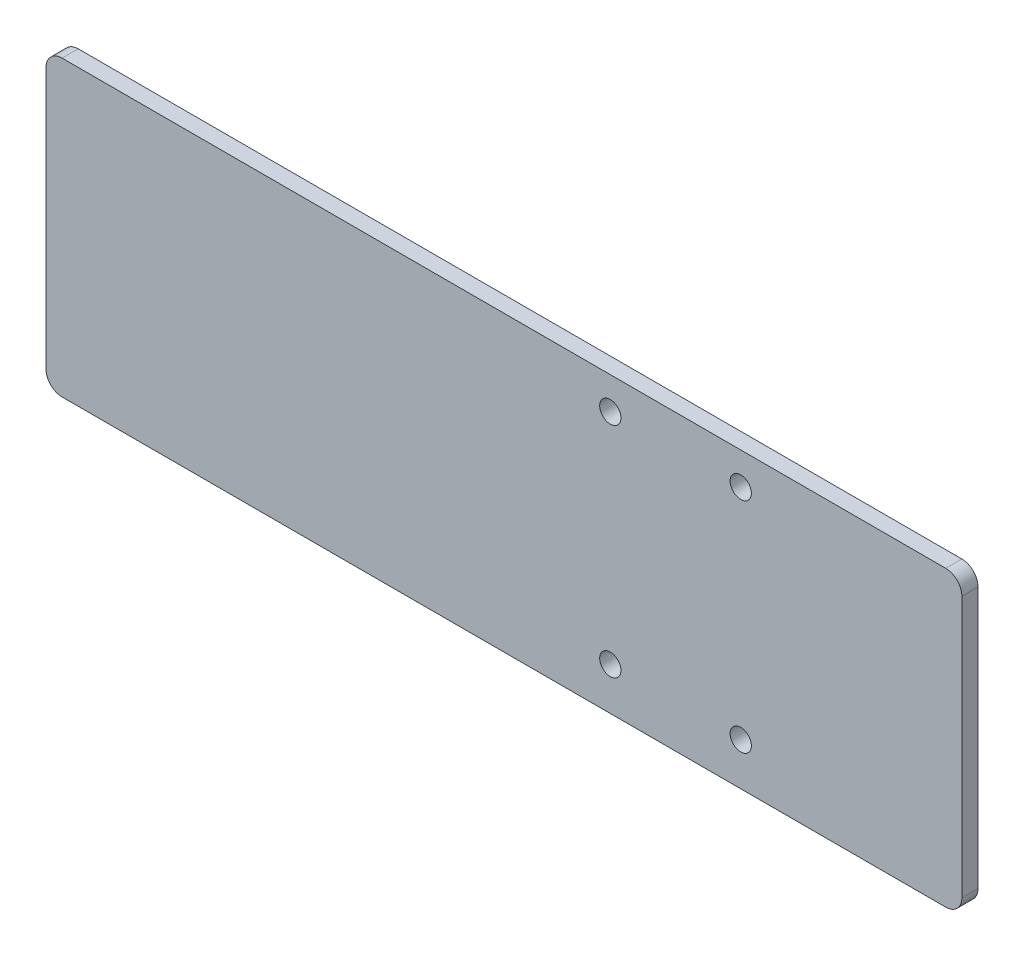
ISO-10303-21;
HEADER;
FILE_DESCRIPTION(('STEP AP214'),'2;1');
FILE_NAME('part.step','',(''),(''),'','','');
FILE_SCHEMA(('AUTOMOTIVE_DESIGN { 1 0 10303 214 1 1 1 1 }'));
ENDSEC;
DATA;
#1=APPLICATION_CONTEXT('core data for automotive mechanical design processes');
#2=APPLICATION_PROTOCOL_DEFINITION('international standard','automotive_design',2000,#1);
#3=PRODUCT_CONTEXT('',#1,'mechanical');
#4=PRODUCT('Part','Part','',(#3));
#5=PRODUCT_RELATED_PRODUCT_CATEGORY('part','',(#4));
#6=PRODUCT_DEFINITION_FORMATION('','',#4);
#7=PRODUCT_DEFINITION_CONTEXT('part definition',#1,'design');
#8=PRODUCT_DEFINITION('design','',#6,#7);
#9=PRODUCT_DEFINITION_SHAPE('','',#8);
#10=(LENGTH_UNIT() NAMED_UNIT(*) SI_UNIT(.MILLI.,.METRE.));
#11=(NAMED_UNIT(*) PLANE_ANGLE_UNIT() SI_UNIT($,.RADIAN.));
#12=(NAMED_UNIT(*) SI_UNIT($,.STERADIAN.) SOLID_ANGLE_UNIT());
#13=UNCERTAINTY_MEASURE_WITH_UNIT(LENGTH_MEASURE(1.E-05),#10,'distance_accuracy_value','');
#14=(GEOMETRIC_REPRESENTATION_CONTEXT(3) GLOBAL_UNCERTAINTY_ASSIGNED_CONTEXT((#13)) GLOBAL_UNIT_ASSIGNED_CONTEXT((#10,
#11,#12)) REPRESENTATION_CONTEXT('',''));
#15=CARTESIAN_POINT('',(0.,0.,0.));
#16=DIRECTION('',(0.,0.,1.));
#17=DIRECTION('',(1.,0.,0.));
#18=AXIS2_PLACEMENT_3D('',#15,#16,#17);
#19=CARTESIAN_POINT('',(137.,40.5,5.));
#20=DIRECTION('',(0.,0.,-1.));
#21=DIRECTION('',(-1.,0.,0.));
#22=AXIS2_PLACEMENT_3D('',#19,#20,#21);
#23=CYLINDRICAL_SURFACE('',#22,4.99999999999999);
#24=CARTESIAN_POINT('',(137.,40.5,0.));
#25=DIRECTION('',(0.,0.,1.));
#26=DIRECTION('',(1.,0.,0.));
#27=AXIS2_PLACEMENT_3D('',#24,#25,#26);
#28=CIRCLE('',#27,4.99999999999999);
#29=CARTESIAN_POINT('',(142.,40.5,0.));
#30=VERTEX_POINT('',#29);
#31=CARTESIAN_POINT('',(137.,45.5,0.));
#32=VERTEX_POINT('',#31);
#33=EDGE_CURVE('E129',#30,#32,#28,.T.);
#34=ORIENTED_EDGE('',*,*,#33,.T.);
#35=DIRECTION('',(0.,0.,-1.));
#36=VECTOR('',#35,1.);
#37=CARTESIAN_POINT('',(137.,45.5,5.));
#38=LINE('',#37,#36);
#39=CARTESIAN_POINT('',(137.,45.5,5.));
#40=VERTEX_POINT('',#39);
#41=EDGE_CURVE('E11',#40,#32,#38,.T.);
#42=ORIENTED_EDGE('',*,*,#41,.F.);
#43=CARTESIAN_POINT('',(137.,40.5,5.));
#44=DIRECTION('',(0.,0.,1.));
#45=DIRECTION('',(1.,0.,0.));
#46=AXIS2_PLACEMENT_3D('',#43,#44,#45);
#47=CIRCLE('',#46,4.99999999999999);
#48=CARTESIAN_POINT('',(142.,40.5,5.));
#49=VERTEX_POINT('',#48);
#50=EDGE_CURVE('E144',#49,#40,#47,.T.);
#51=ORIENTED_EDGE('',*,*,#50,.F.);
#52=DIRECTION('',(0.,0.,-1.));
#53=VECTOR('',#52,1.);
#54=CARTESIAN_POINT('',(142.,40.5,5.));
#55=LINE('',#54,#53);
#56=EDGE_CURVE('E125',#49,#30,#55,.T.);
#57=ORIENTED_EDGE('',*,*,#56,.T.);
#58=EDGE_LOOP('',(#34,#42,#51,#57));
#59=FACE_BOUND('',#58,.T.);
#60=ADVANCED_FACE('F33',(#59),#23,.T.);
#61=CARTESIAN_POINT('',(-137.,45.5,5.));
#62=DIRECTION('',(0.,-1.,0.));
#63=DIRECTION('',(0.,0.,-1.));
#64=AXIS2_PLACEMENT_3D('',#61,#62,#63);
#65=PLANE('',#64);
#66=DIRECTION('',(-1.,0.,0.));
#67=VECTOR('',#66,1.);
#68=CARTESIAN_POINT('',(-137.,45.5,0.));
#69=LINE('',#68,#67);
#70=CARTESIAN_POINT('',(-137.,45.5,0.));
#71=VERTEX_POINT('',#70);
#72=EDGE_CURVE('E132',#32,#71,#69,.T.);
#73=ORIENTED_EDGE('',*,*,#72,.T.);
#74=DIRECTION('',(0.,0.,-1.));
#75=VECTOR('',#74,1.);
#76=CARTESIAN_POINT('',(-137.,45.5,5.));
#77=LINE('',#76,#75);
#78=CARTESIAN_POINT('',(-137.,45.5,5.));
#79=VERTEX_POINT('',#78);
#80=EDGE_CURVE('E41',#79,#71,#77,.T.);
#81=ORIENTED_EDGE('',*,*,#80,.F.);
#82=DIRECTION('',(-1.,0.,0.));
#83=VECTOR('',#82,1.);
#84=CARTESIAN_POINT('',(-137.,45.5,5.));
#85=LINE('',#84,#83);
#86=EDGE_CURVE('E92',#40,#79,#85,.T.);
#87=ORIENTED_EDGE('',*,*,#86,.F.);
#88=ORIENTED_EDGE('',*,*,#41,.T.);
#89=EDGE_LOOP('',(#73,#81,#87,#88));
#90=FACE_BOUND('',#89,.T.);
#91=ADVANCED_FACE('F225',(#90),#65,.F.);
#92=CARTESIAN_POINT('',(-137.,40.5,5.));
#93=DIRECTION('',(0.,0.,-1.));
#94=DIRECTION('',(-1.,0.,0.));
#95=AXIS2_PLACEMENT_3D('',#92,#93,#94);
#96=CYLINDRICAL_SURFACE('',#95,5.);
#97=CARTESIAN_POINT('',(-137.,40.5,0.));
#98=DIRECTION('',(0.,0.,1.));
#99=DIRECTION('',(-1.,0.,0.));
#100=AXIS2_PLACEMENT_3D('',#97,#98,#99);
#101=CIRCLE('',#100,5.);
#102=CARTESIAN_POINT('',(-142.,40.5,0.));
#103=VERTEX_POINT('',#102);
#104=EDGE_CURVE('E135',#71,#103,#101,.T.);
#105=ORIENTED_EDGE('',*,*,#104,.T.);
#106=DIRECTION('',(0.,0.,-1.));
#107=VECTOR('',#106,1.);
#108=CARTESIAN_POINT('',(-142.,40.5,5.));
#109=LINE('',#108,#107);
#110=CARTESIAN_POINT('',(-142.,40.5,5.));
#111=VERTEX_POINT('',#110);
#112=EDGE_CURVE('E151',#111,#103,#109,.T.);
#113=ORIENTED_EDGE('',*,*,#112,.F.);
#114=CARTESIAN_POINT('',(-137.,40.5,5.));
#115=DIRECTION('',(0.,0.,1.));
#116=DIRECTION('',(-1.,0.,0.));
#117=AXIS2_PLACEMENT_3D('',#114,#115,#116);
#118=CIRCLE('',#117,5.);
#119=EDGE_CURVE('E159',#79,#111,#118,.T.);
#120=ORIENTED_EDGE('',*,*,#119,.F.);
#121=ORIENTED_EDGE('',*,*,#80,.T.);
#122=EDGE_LOOP('',(#105,#113,#120,#121));
#123=FACE_BOUND('',#122,.T.);
#124=ADVANCED_FACE('F157',(#123),#96,.T.);
#125=CARTESIAN_POINT('',(-142.,-40.5,5.));
#126=DIRECTION('',(1.,0.,0.));
#127=DIRECTION('',(0.,0.,-1.));
#128=AXIS2_PLACEMENT_3D('',#125,#126,#127);
#129=PLANE('',#128);
#130=DIRECTION('',(0.,-1.,0.));
#131=VECTOR('',#130,1.);
#132=CARTESIAN_POINT('',(-142.,-40.5,0.));
#133=LINE('',#132,#131);
#134=CARTESIAN_POINT('',(-142.,-40.5,0.));
#135=VERTEX_POINT('',#134);
#136=EDGE_CURVE('E137',#103,#135,#133,.T.);
#137=ORIENTED_EDGE('',*,*,#136,.T.);
#138=DIRECTION('',(0.,0.,-1.));
#139=VECTOR('',#138,1.);
#140=CARTESIAN_POINT('',(-142.,-40.5,5.));
#141=LINE('',#140,#139);
#142=CARTESIAN_POINT('',(-142.,-40.5,5.));
#143=VERTEX_POINT('',#142);
#144=EDGE_CURVE('E148',#143,#135,#141,.T.);
#145=ORIENTED_EDGE('',*,*,#144,.F.);
#146=DIRECTION('',(0.,-1.,0.));
#147=VECTOR('',#146,1.);
#148=CARTESIAN_POINT('',(-142.,-40.5,5.));
#149=LINE('',#148,#147);
#150=EDGE_CURVE('E171',#111,#143,#149,.T.);
#151=ORIENTED_EDGE('',*,*,#150,.F.);
#152=ORIENTED_EDGE('',*,*,#112,.T.);
#153=EDGE_LOOP('',(#137,#145,#151,#152));
#154=FACE_BOUND('',#153,.T.);
#155=ADVANCED_FACE('F167',(#154),#129,.F.);
#156=CARTESIAN_POINT('',(-137.,-40.5,5.));
#157=DIRECTION('',(0.,0.,-1.));
#158=DIRECTION('',(-1.,0.,0.));
#159=AXIS2_PLACEMENT_3D('',#156,#157,#158);
#160=CYLINDRICAL_SURFACE('',#159,5.);
#161=CARTESIAN_POINT('',(-137.,-40.5,0.));
#162=DIRECTION('',(0.,0.,1.));
#163=DIRECTION('',(-1.,0.,0.));
#164=AXIS2_PLACEMENT_3D('',#161,#162,#163);
#165=CIRCLE('',#164,5.);
#166=CARTESIAN_POINT('',(-137.,-45.5,0.));
#167=VERTEX_POINT('',#166);
#168=EDGE_CURVE('E139',#135,#167,#165,.T.);
#169=ORIENTED_EDGE('',*,*,#168,.T.);
#170=DIRECTION('',(0.,0.,-1.));
#171=VECTOR('',#170,1.);
#172=CARTESIAN_POINT('',(-137.,-45.5,5.));
#173=LINE('',#172,#171);
#174=CARTESIAN_POINT('',(-137.,-45.5,5.));
#175=VERTEX_POINT('',#174);
#176=EDGE_CURVE('E120',#175,#167,#173,.T.);
#177=ORIENTED_EDGE('',*,*,#176,.F.);
#178=CARTESIAN_POINT('',(-137.,-40.5,5.));
#179=DIRECTION('',(0.,0.,1.));
#180=DIRECTION('',(-1.,0.,0.));
#181=AXIS2_PLACEMENT_3D('',#178,#179,#180);
#182=CIRCLE('',#181,5.);
#183=EDGE_CURVE('E111',#143,#175,#182,.T.);
#184=ORIENTED_EDGE('',*,*,#183,.F.);
#185=ORIENTED_EDGE('',*,*,#144,.T.);
#186=EDGE_LOOP('',(#169,#177,#184,#185));
#187=FACE_BOUND('',#186,.T.);
#188=ADVANCED_FACE('F170',(#187),#160,.T.);
#189=CARTESIAN_POINT('',(-137.,-45.5,5.));
#190=DIRECTION('',(0.,1.,0.));
#191=DIRECTION('',(0.,0.,1.));
#192=AXIS2_PLACEMENT_3D('',#189,#190,#191);
#193=PLANE('',#192);
#194=DIRECTION('',(1.,0.,0.));
#195=VECTOR('',#194,1.);
#196=CARTESIAN_POINT('',(-137.,-45.5,0.));
#197=LINE('',#196,#195);
#198=CARTESIAN_POINT('',(137.,-45.5,0.));
#199=VERTEX_POINT('',#198);
#200=EDGE_CURVE('E119',#167,#199,#197,.T.);
#201=ORIENTED_EDGE('',*,*,#200,.T.);
#202=DIRECTION('',(0.,0.,-1.));
#203=VECTOR('',#202,1.);
#204=CARTESIAN_POINT('',(137.,-45.5,5.));
#205=LINE('',#204,#203);
#206=CARTESIAN_POINT('',(137.,-45.5,5.));
#207=VERTEX_POINT('',#206);
#208=EDGE_CURVE('E116',#207,#199,#205,.T.);
#209=ORIENTED_EDGE('',*,*,#208,.F.);
#210=DIRECTION('',(1.,0.,0.));
#211=VECTOR('',#210,1.);
#212=CARTESIAN_POINT('',(-137.,-45.5,5.));
#213=LINE('',#212,#211);
#214=EDGE_CURVE('E105',#175,#207,#213,.T.);
#215=ORIENTED_EDGE('',*,*,#214,.F.);
#216=ORIENTED_EDGE('',*,*,#176,.T.);
#217=EDGE_LOOP('',(#201,#209,#215,#216));
#218=FACE_BOUND('',#217,.T.);
#219=ADVANCED_FACE('F117',(#218),#193,.F.);
#220=CARTESIAN_POINT('',(137.,-40.5,5.));
#221=DIRECTION('',(0.,0.,-1.));
#222=DIRECTION('',(-1.,0.,0.));
#223=AXIS2_PLACEMENT_3D('',#220,#221,#222);
#224=CYLINDRICAL_SURFACE('',#223,4.99999999999999);
#225=CARTESIAN_POINT('',(137.,-40.5,0.));
#226=DIRECTION('',(0.,0.,1.));
#227=DIRECTION('',(-1.,0.,0.));
#228=AXIS2_PLACEMENT_3D('',#225,#226,#227);
#229=CIRCLE('',#228,4.99999999999999);
#230=CARTESIAN_POINT('',(142.,-40.5,0.));
#231=VERTEX_POINT('',#230);
#232=EDGE_CURVE('E78',#199,#231,#229,.T.);
#233=ORIENTED_EDGE('',*,*,#232,.T.);
#234=DIRECTION('',(0.,0.,-1.));
#235=VECTOR('',#234,1.);
#236=CARTESIAN_POINT('',(142.,-40.5,5.));
#237=LINE('',#236,#235);
#238=CARTESIAN_POINT('',(142.,-40.5,5.));
#239=VERTEX_POINT('',#238);
#240=EDGE_CURVE('E121',#239,#231,#237,.T.);
#241=ORIENTED_EDGE('',*,*,#240,.F.);
#242=CARTESIAN_POINT('',(137.,-40.5,5.));
#243=DIRECTION('',(0.,0.,1.));
#244=DIRECTION('',(-1.,0.,0.));
#245=AXIS2_PLACEMENT_3D('',#242,#243,#244);
#246=CIRCLE('',#245,4.99999999999999);
#247=EDGE_CURVE('E109',#207,#239,#246,.T.);
#248=ORIENTED_EDGE('',*,*,#247,.F.);
#249=ORIENTED_EDGE('',*,*,#208,.T.);
#250=EDGE_LOOP('',(#233,#241,#248,#249));
#251=FACE_BOUND('',#250,.T.);
#252=ADVANCED_FACE('F123',(#251),#224,.T.);
#253=CARTESIAN_POINT('',(142.,-40.5,5.));
#254=DIRECTION('',(-1.,0.,0.));
#255=DIRECTION('',(0.,0.,1.));
#256=AXIS2_PLACEMENT_3D('',#253,#254,#255);
#257=PLANE('',#256);
#258=DIRECTION('',(0.,1.,0.));
#259=VECTOR('',#258,1.);
#260=CARTESIAN_POINT('',(142.,-40.5,0.));
#261=LINE('',#260,#259);
#262=EDGE_CURVE('E84',#231,#30,#261,.T.);
#263=ORIENTED_EDGE('',*,*,#262,.T.);
#264=ORIENTED_EDGE('',*,*,#56,.F.);
#265=DIRECTION('',(0.,1.,0.));
#266=VECTOR('',#265,1.);
#267=CARTESIAN_POINT('',(142.,-40.5,5.));
#268=LINE('',#267,#266);
#269=EDGE_CURVE('E49',#239,#49,#268,.T.);
#270=ORIENTED_EDGE('',*,*,#269,.F.);
#271=ORIENTED_EDGE('',*,*,#240,.T.);
#272=EDGE_LOOP('',(#263,#264,#270,#271));
#273=FACE_BOUND('',#272,.T.);
#274=ADVANCED_FACE('F232',(#273),#257,.F.);
#275=CARTESIAN_POINT('',(137.,40.5,5.));
#276=DIRECTION('',(0.,0.,1.));
#277=DIRECTION('',(1.,0.,0.));
#278=AXIS2_PLACEMENT_3D('',#275,#276,#277);
#279=PLANE('',#278);
#280=CARTESIAN_POINT('',(73.4316140027902,-32.2991774375296,5.));
#281=DIRECTION('',(0.,0.,1.));
#282=DIRECTION('',(1.,0.,0.));
#283=AXIS2_PLACEMENT_3D('',#280,#281,#282);
#284=CIRCLE('',#283,3.29999999999998);
#285=CARTESIAN_POINT('',(76.7316140027902,-32.2991774375296,5.));
#286=VERTEX_POINT('',#285);
#287=EDGE_CURVE('E194',#286,#286,#284,.T.);
#288=ORIENTED_EDGE('',*,*,#287,.F.);
#289=EDGE_LOOP('',(#288));
#290=FACE_BOUND('',#289,.T.);
#291=CARTESIAN_POINT('',(32.9876867206584,-32.2991774375296,5.));
#292=DIRECTION('',(0.,0.,1.));
#293=DIRECTION('',(1.,0.,0.));
#294=AXIS2_PLACEMENT_3D('',#291,#292,#293);
#295=CIRCLE('',#294,3.29999999999999);
#296=CARTESIAN_POINT('',(36.2876867206584,-32.2991774375296,5.));
#297=VERTEX_POINT('',#296);
#298=EDGE_CURVE('E188',#297,#297,#295,.T.);
#299=ORIENTED_EDGE('',*,*,#298,.F.);
#300=EDGE_LOOP('',(#299));
#301=FACE_BOUND('',#300,.T.);
#302=CARTESIAN_POINT('',(32.9876867206584,35.5092127960432,5.));
#303=DIRECTION('',(0.,0.,1.));
#304=DIRECTION('',(1.,0.,0.));
#305=AXIS2_PLACEMENT_3D('',#302,#303,#304);
#306=CIRCLE('',#305,3.29999999999999);
#307=CARTESIAN_POINT('',(36.2876867206584,35.5092127960432,5.));
#308=VERTEX_POINT('',#307);
#309=EDGE_CURVE('E182',#308,#308,#306,.T.);
#310=ORIENTED_EDGE('',*,*,#309,.F.);
#311=EDGE_LOOP('',(#310));
#312=FACE_BOUND('',#311,.T.);
#313=CARTESIAN_POINT('',(73.4316140027902,35.5092127960432,5.));
#314=DIRECTION('',(0.,0.,1.));
#315=DIRECTION('',(1.,0.,0.));
#316=AXIS2_PLACEMENT_3D('',#313,#314,#315);
#317=CIRCLE('',#316,3.29999999999998);
#318=CARTESIAN_POINT('',(76.7316140027902,35.5092127960432,5.));
#319=VERTEX_POINT('',#318);
#320=EDGE_CURVE('E133',#319,#319,#317,.T.);
#321=ORIENTED_EDGE('',*,*,#320,.F.);
#322=EDGE_LOOP('',(#321));
#323=FACE_BOUND('',#322,.T.);
#324=ORIENTED_EDGE('',*,*,#50,.T.);
#325=ORIENTED_EDGE('',*,*,#86,.T.);
#326=ORIENTED_EDGE('',*,*,#119,.T.);
#327=ORIENTED_EDGE('',*,*,#150,.T.);
#328=ORIENTED_EDGE('',*,*,#183,.T.);
#329=ORIENTED_EDGE('',*,*,#214,.T.);
#330=ORIENTED_EDGE('',*,*,#247,.T.);
#331=ORIENTED_EDGE('',*,*,#269,.T.);
#332=EDGE_LOOP('',(#324,#325,#326,#327,#328,#329,#330,#331));
#333=FACE_BOUND('',#332,.T.);
#334=ADVANCED_FACE('F107',(#290,#301,#312,#323,#333),#279,.T.);
#335=CARTESIAN_POINT('',(137.,40.5,0.));
#336=DIRECTION('',(0.,0.,1.));
#337=DIRECTION('',(1.,0.,0.));
#338=AXIS2_PLACEMENT_3D('',#335,#336,#337);
#339=PLANE('',#338);
#340=CARTESIAN_POINT('',(73.4316140027902,-32.2991774375296,0.));
#341=DIRECTION('',(0.,0.,-1.));
#342=DIRECTION('',(-1.,0.,0.));
#343=AXIS2_PLACEMENT_3D('',#340,#341,#342);
#344=CIRCLE('',#343,3.29999999999998);
#345=CARTESIAN_POINT('',(70.1316140027902,-32.2991774375296,0.));
#346=VERTEX_POINT('',#345);
#347=EDGE_CURVE('E197',#346,#346,#344,.T.);
#348=ORIENTED_EDGE('',*,*,#347,.F.);
#349=EDGE_LOOP('',(#348));
#350=FACE_BOUND('',#349,.T.);
#351=CARTESIAN_POINT('',(32.9876867206584,-32.2991774375296,0.));
#352=DIRECTION('',(0.,0.,-1.));
#353=DIRECTION('',(-1.,0.,0.));
#354=AXIS2_PLACEMENT_3D('',#351,#352,#353);
#355=CIRCLE('',#354,3.29999999999999);
#356=CARTESIAN_POINT('',(29.6876867206584,-32.2991774375296,0.));
#357=VERTEX_POINT('',#356);
#358=EDGE_CURVE('E191',#357,#357,#355,.T.);
#359=ORIENTED_EDGE('',*,*,#358,.F.);
#360=EDGE_LOOP('',(#359));
#361=FACE_BOUND('',#360,.T.);
#362=CARTESIAN_POINT('',(32.9876867206584,35.5092127960432,0.));
#363=DIRECTION('',(0.,0.,-1.));
#364=DIRECTION('',(-1.,0.,0.));
#365=AXIS2_PLACEMENT_3D('',#362,#363,#364);
#366=CIRCLE('',#365,3.29999999999999);
#367=CARTESIAN_POINT('',(29.6876867206584,35.5092127960432,0.));
#368=VERTEX_POINT('',#367);
#369=EDGE_CURVE('E185',#368,#368,#366,.T.);
#370=ORIENTED_EDGE('',*,*,#369,.F.);
#371=EDGE_LOOP('',(#370));
#372=FACE_BOUND('',#371,.T.);
#373=CARTESIAN_POINT('',(73.4316140027902,35.5092127960432,0.));
#374=DIRECTION('',(0.,0.,-1.));
#375=DIRECTION('',(-1.,0.,0.));
#376=AXIS2_PLACEMENT_3D('',#373,#374,#375);
#377=CIRCLE('',#376,3.29999999999998);
#378=CARTESIAN_POINT('',(70.1316140027902,35.5092127960432,0.));
#379=VERTEX_POINT('',#378);
#380=EDGE_CURVE('E179',#379,#379,#377,.T.);
#381=ORIENTED_EDGE('',*,*,#380,.F.);
#382=EDGE_LOOP('',(#381));
#383=FACE_BOUND('',#382,.T.);
#384=ORIENTED_EDGE('',*,*,#33,.F.);
#385=ORIENTED_EDGE('',*,*,#262,.F.);
#386=ORIENTED_EDGE('',*,*,#232,.F.);
#387=ORIENTED_EDGE('',*,*,#200,.F.);
#388=ORIENTED_EDGE('',*,*,#168,.F.);
#389=ORIENTED_EDGE('',*,*,#136,.F.);
#390=ORIENTED_EDGE('',*,*,#104,.F.);
#391=ORIENTED_EDGE('',*,*,#72,.F.);
#392=EDGE_LOOP('',(#384,#385,#386,#387,#388,#389,#390,#391));
#393=FACE_BOUND('',#392,.T.);
#394=ADVANCED_FACE('F163',(#350,#361,#372,#383,#393),#339,.F.);
#395=CARTESIAN_POINT('',(73.4316140027902,35.5092127960432,0.));
#396=DIRECTION('',(0.,0.,-1.));
#397=DIRECTION('',(-1.,0.,0.));
#398=AXIS2_PLACEMENT_3D('',#395,#396,#397);
#399=CYLINDRICAL_SURFACE('',#398,3.29999999999998);
#400=ORIENTED_EDGE('',*,*,#320,.T.);
#401=EDGE_LOOP('',(#400));
#402=FACE_BOUND('',#401,.T.);
#403=ORIENTED_EDGE('',*,*,#380,.T.);
#404=EDGE_LOOP('',(#403));
#405=FACE_BOUND('',#404,.T.);
#406=ADVANCED_FACE('F205',(#402,#405),#399,.F.);
#407=CARTESIAN_POINT('',(32.9876867206584,35.5092127960432,0.));
#408=DIRECTION('',(0.,0.,-1.));
#409=DIRECTION('',(-1.,0.,0.));
#410=AXIS2_PLACEMENT_3D('',#407,#408,#409);
#411=CYLINDRICAL_SURFACE('',#410,3.29999999999999);
#412=ORIENTED_EDGE('',*,*,#309,.T.);
#413=EDGE_LOOP('',(#412));
#414=FACE_BOUND('',#413,.T.);
#415=ORIENTED_EDGE('',*,*,#369,.T.);
#416=EDGE_LOOP('',(#415));
#417=FACE_BOUND('',#416,.T.);
#418=ADVANCED_FACE('F214',(#414,#417),#411,.F.);
#419=CARTESIAN_POINT('',(32.9876867206584,-32.2991774375296,0.));
#420=DIRECTION('',(0.,0.,-1.));
#421=DIRECTION('',(-1.,0.,0.));
#422=AXIS2_PLACEMENT_3D('',#419,#420,#421);
#423=CYLINDRICAL_SURFACE('',#422,3.29999999999999);
#424=ORIENTED_EDGE('',*,*,#298,.T.);
#425=EDGE_LOOP('',(#424));
#426=FACE_BOUND('',#425,.T.);
#427=ORIENTED_EDGE('',*,*,#358,.T.);
#428=EDGE_LOOP('',(#427));
#429=FACE_BOUND('',#428,.T.);
#430=ADVANCED_FACE('F220',(#426,#429),#423,.F.);
#431=CARTESIAN_POINT('',(73.4316140027902,-32.2991774375296,0.));
#432=DIRECTION('',(0.,0.,-1.));
#433=DIRECTION('',(-1.,0.,0.));
#434=AXIS2_PLACEMENT_3D('',#431,#432,#433);
#435=CYLINDRICAL_SURFACE('',#434,3.29999999999998);
#436=ORIENTED_EDGE('',*,*,#287,.T.);
#437=EDGE_LOOP('',(#436));
#438=FACE_BOUND('',#437,.T.);
#439=ORIENTED_EDGE('',*,*,#347,.T.);
#440=EDGE_LOOP('',(#439));
#441=FACE_BOUND('',#440,.T.);
#442=ADVANCED_FACE('F201',(#438,#441),#435,.F.);
#443=CLOSED_SHELL('',(#60,#91,#124,#155,#188,#219,#252,#274,#334,#394,#406,#418,#430,#442));
#444=MANIFOLD_SOLID_BREP('B2',#443);
#445=ADVANCED_BREP_SHAPE_REPRESENTATION('',(#18,#444),#14);
#446=SHAPE_DEFINITION_REPRESENTATION(#9,#445);
ENDSEC;
END-ISO-10303-21;
